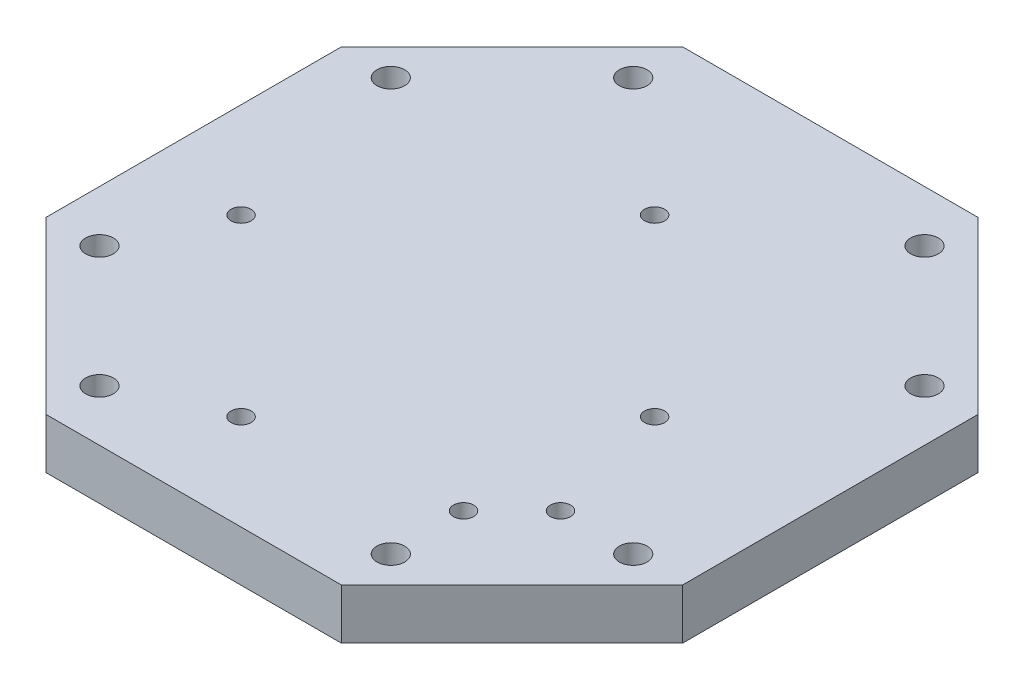
ISO-10303-21;
HEADER;
FILE_DESCRIPTION(('STEP AP214'),'2;1');
FILE_NAME('part.step','',(''),(''),'','','');
FILE_SCHEMA(('AUTOMOTIVE_DESIGN { 1 0 10303 214 1 1 1 1 }'));
ENDSEC;
DATA;
#1=APPLICATION_CONTEXT('core data for automotive mechanical design processes');
#2=APPLICATION_PROTOCOL_DEFINITION('international standard','automotive_design',2000,#1);
#3=PRODUCT_CONTEXT('',#1,'mechanical');
#4=PRODUCT('Part','Part','',(#3));
#5=PRODUCT_RELATED_PRODUCT_CATEGORY('part','',(#4));
#6=PRODUCT_DEFINITION_FORMATION('','',#4);
#7=PRODUCT_DEFINITION_CONTEXT('part definition',#1,'design');
#8=PRODUCT_DEFINITION('design','',#6,#7);
#9=PRODUCT_DEFINITION_SHAPE('','',#8);
#10=(LENGTH_UNIT() NAMED_UNIT(*) SI_UNIT(.MILLI.,.METRE.));
#11=(NAMED_UNIT(*) PLANE_ANGLE_UNIT() SI_UNIT($,.RADIAN.));
#12=(NAMED_UNIT(*) SI_UNIT($,.STERADIAN.) SOLID_ANGLE_UNIT());
#13=UNCERTAINTY_MEASURE_WITH_UNIT(LENGTH_MEASURE(1.E-05),#10,'distance_accuracy_value','');
#14=(GEOMETRIC_REPRESENTATION_CONTEXT(3) GLOBAL_UNCERTAINTY_ASSIGNED_CONTEXT((#13)) GLOBAL_UNIT_ASSIGNED_CONTEXT((#10,
#11,#12)) REPRESENTATION_CONTEXT('',''));
#15=CARTESIAN_POINT('',(0.,0.,0.));
#16=DIRECTION('',(0.,0.,1.));
#17=DIRECTION('',(1.,0.,0.));
#18=AXIS2_PLACEMENT_3D('',#15,#16,#17);
#19=CARTESIAN_POINT('',(29.2914316275719,10.,63.135145942252));
#20=DIRECTION('',(-0.707106781186547,0.,-0.707106781186548));
#21=DIRECTION('',(-0.707106781186548,0.,0.707106781186547));
#22=AXIS2_PLACEMENT_3D('',#19,#20,#21);
#23=PLANE('',#22);
#24=DIRECTION('',(0.707106781186548,0.,-0.707106781186547));
#25=VECTOR('',#24,1.);
#26=CARTESIAN_POINT('',(29.2914316275719,0.,63.135145942252));
#27=LINE('',#26,#25);
#28=CARTESIAN_POINT('',(29.2914316275719,0.,63.135145942252));
#29=VERTEX_POINT('',#28);
#30=CARTESIAN_POINT('',(63.1351459422521,0.,29.2914316275719));
#31=VERTEX_POINT('',#30);
#32=EDGE_CURVE('E141',#29,#31,#27,.T.);
#33=ORIENTED_EDGE('',*,*,#32,.T.);
#34=DIRECTION('',(0.,-1.,0.));
#35=VECTOR('',#34,1.);
#36=CARTESIAN_POINT('',(63.1351459422521,10.,29.2914316275719));
#37=LINE('',#36,#35);
#38=CARTESIAN_POINT('',(63.1351459422521,10.,29.2914316275719));
#39=VERTEX_POINT('',#38);
#40=EDGE_CURVE('E11',#39,#31,#37,.T.);
#41=ORIENTED_EDGE('',*,*,#40,.F.);
#42=DIRECTION('',(0.707106781186548,0.,-0.707106781186547));
#43=VECTOR('',#42,1.);
#44=CARTESIAN_POINT('',(29.2914316275719,10.,63.135145942252));
#45=LINE('',#44,#43);
#46=CARTESIAN_POINT('',(29.2914316275719,10.,63.135145942252));
#47=VERTEX_POINT('',#46);
#48=EDGE_CURVE('E156',#47,#39,#45,.T.);
#49=ORIENTED_EDGE('',*,*,#48,.F.);
#50=DIRECTION('',(0.,-1.,0.));
#51=VECTOR('',#50,1.);
#52=CARTESIAN_POINT('',(29.2914316275719,10.,63.135145942252));
#53=LINE('',#52,#51);
#54=EDGE_CURVE('E137',#47,#29,#53,.T.);
#55=ORIENTED_EDGE('',*,*,#54,.T.);
#56=EDGE_LOOP('',(#33,#41,#49,#55));
#57=FACE_BOUND('',#56,.T.);
#58=ADVANCED_FACE('F45',(#57),#23,.F.);
#59=CARTESIAN_POINT('',(63.1351459422521,10.,29.2914316275719));
#60=DIRECTION('',(-1.,0.,0.));
#61=DIRECTION('',(0.,0.,1.));
#62=AXIS2_PLACEMENT_3D('',#59,#60,#61);
#63=PLANE('',#62);
#64=DIRECTION('',(0.,0.,-1.));
#65=VECTOR('',#64,1.);
#66=CARTESIAN_POINT('',(63.1351459422521,0.,29.2914316275719));
#67=LINE('',#66,#65);
#68=CARTESIAN_POINT('',(63.1351459422521,0.,-29.2914316275719));
#69=VERTEX_POINT('',#68);
#70=EDGE_CURVE('E144',#31,#69,#67,.T.);
#71=ORIENTED_EDGE('',*,*,#70,.T.);
#72=DIRECTION('',(0.,-1.,0.));
#73=VECTOR('',#72,1.);
#74=CARTESIAN_POINT('',(63.1351459422521,10.,-29.2914316275719));
#75=LINE('',#74,#73);
#76=CARTESIAN_POINT('',(63.1351459422521,10.,-29.2914316275719));
#77=VERTEX_POINT('',#76);
#78=EDGE_CURVE('E53',#77,#69,#75,.T.);
#79=ORIENTED_EDGE('',*,*,#78,.F.);
#80=DIRECTION('',(0.,0.,-1.));
#81=VECTOR('',#80,1.);
#82=CARTESIAN_POINT('',(63.1351459422521,10.,29.2914316275719));
#83=LINE('',#82,#81);
#84=EDGE_CURVE('E104',#39,#77,#83,.T.);
#85=ORIENTED_EDGE('',*,*,#84,.F.);
#86=ORIENTED_EDGE('',*,*,#40,.T.);
#87=EDGE_LOOP('',(#71,#79,#85,#86));
#88=FACE_BOUND('',#87,.T.);
#89=ADVANCED_FACE('F387',(#88),#63,.F.);
#90=CARTESIAN_POINT('',(63.1351459422521,10.,-29.2914316275719));
#91=DIRECTION('',(-0.707106781186547,0.,0.707106781186548));
#92=DIRECTION('',(0.707106781186548,0.,0.707106781186547));
#93=AXIS2_PLACEMENT_3D('',#90,#91,#92);
#94=PLANE('',#93);
#95=DIRECTION('',(-0.707106781186548,0.,-0.707106781186547));
#96=VECTOR('',#95,1.);
#97=CARTESIAN_POINT('',(63.1351459422521,0.,-29.2914316275719));
#98=LINE('',#97,#96);
#99=CARTESIAN_POINT('',(29.2914316275719,0.,-63.135145942252));
#100=VERTEX_POINT('',#99);
#101=EDGE_CURVE('E147',#69,#100,#98,.T.);
#102=ORIENTED_EDGE('',*,*,#101,.T.);
#103=DIRECTION('',(0.,-1.,0.));
#104=VECTOR('',#103,1.);
#105=CARTESIAN_POINT('',(29.2914316275719,10.,-63.135145942252));
#106=LINE('',#105,#104);
#107=CARTESIAN_POINT('',(29.2914316275719,10.,-63.135145942252));
#108=VERTEX_POINT('',#107);
#109=EDGE_CURVE('E163',#108,#100,#106,.T.);
#110=ORIENTED_EDGE('',*,*,#109,.F.);
#111=DIRECTION('',(-0.707106781186548,0.,-0.707106781186547));
#112=VECTOR('',#111,1.);
#113=CARTESIAN_POINT('',(63.1351459422521,10.,-29.2914316275719));
#114=LINE('',#113,#112);
#115=EDGE_CURVE('E171',#77,#108,#114,.T.);
#116=ORIENTED_EDGE('',*,*,#115,.F.);
#117=ORIENTED_EDGE('',*,*,#78,.T.);
#118=EDGE_LOOP('',(#102,#110,#116,#117));
#119=FACE_BOUND('',#118,.T.);
#120=ADVANCED_FACE('F169',(#119),#94,.F.);
#121=CARTESIAN_POINT('',(29.2914316275719,10.,-63.135145942252));
#122=DIRECTION('',(0.,0.,1.));
#123=DIRECTION('',(1.,0.,0.));
#124=AXIS2_PLACEMENT_3D('',#121,#122,#123);
#125=PLANE('',#124);
#126=DIRECTION('',(-1.,0.,0.));
#127=VECTOR('',#126,1.);
#128=CARTESIAN_POINT('',(29.2914316275719,0.,-63.135145942252));
#129=LINE('',#128,#127);
#130=CARTESIAN_POINT('',(-29.2914316275719,0.,-63.135145942252));
#131=VERTEX_POINT('',#130);
#132=EDGE_CURVE('E149',#100,#131,#129,.T.);
#133=ORIENTED_EDGE('',*,*,#132,.T.);
#134=DIRECTION('',(0.,-1.,0.));
#135=VECTOR('',#134,1.);
#136=CARTESIAN_POINT('',(-29.2914316275719,10.,-63.135145942252));
#137=LINE('',#136,#135);
#138=CARTESIAN_POINT('',(-29.2914316275719,10.,-63.135145942252));
#139=VERTEX_POINT('',#138);
#140=EDGE_CURVE('E160',#139,#131,#137,.T.);
#141=ORIENTED_EDGE('',*,*,#140,.F.);
#142=DIRECTION('',(-1.,0.,0.));
#143=VECTOR('',#142,1.);
#144=CARTESIAN_POINT('',(29.2914316275719,10.,-63.135145942252));
#145=LINE('',#144,#143);
#146=EDGE_CURVE('E183',#108,#139,#145,.T.);
#147=ORIENTED_EDGE('',*,*,#146,.F.);
#148=ORIENTED_EDGE('',*,*,#109,.T.);
#149=EDGE_LOOP('',(#133,#141,#147,#148));
#150=FACE_BOUND('',#149,.T.);
#151=ADVANCED_FACE('F179',(#150),#125,.F.);
#152=CARTESIAN_POINT('',(-29.2914316275719,10.,-63.135145942252));
#153=DIRECTION('',(0.707106781186548,0.,0.707106781186548));
#154=DIRECTION('',(0.707106781186548,0.,-0.707106781186548));
#155=AXIS2_PLACEMENT_3D('',#152,#153,#154);
#156=PLANE('',#155);
#157=DIRECTION('',(-0.707106781186548,0.,0.707106781186548));
#158=VECTOR('',#157,1.);
#159=CARTESIAN_POINT('',(-29.2914316275719,0.,-63.135145942252));
#160=LINE('',#159,#158);
#161=CARTESIAN_POINT('',(-63.135145942252,0.,-29.2914316275719));
#162=VERTEX_POINT('',#161);
#163=EDGE_CURVE('E151',#131,#162,#160,.T.);
#164=ORIENTED_EDGE('',*,*,#163,.T.);
#165=DIRECTION('',(0.,-1.,0.));
#166=VECTOR('',#165,1.);
#167=CARTESIAN_POINT('',(-63.135145942252,10.,-29.2914316275719));
#168=LINE('',#167,#166);
#169=CARTESIAN_POINT('',(-63.135145942252,10.,-29.2914316275719));
#170=VERTEX_POINT('',#169);
#171=EDGE_CURVE('E132',#170,#162,#168,.T.);
#172=ORIENTED_EDGE('',*,*,#171,.F.);
#173=DIRECTION('',(-0.707106781186548,0.,0.707106781186548));
#174=VECTOR('',#173,1.);
#175=CARTESIAN_POINT('',(-29.2914316275719,10.,-63.135145942252));
#176=LINE('',#175,#174);
#177=EDGE_CURVE('E123',#139,#170,#176,.T.);
#178=ORIENTED_EDGE('',*,*,#177,.F.);
#179=ORIENTED_EDGE('',*,*,#140,.T.);
#180=EDGE_LOOP('',(#164,#172,#178,#179));
#181=FACE_BOUND('',#180,.T.);
#182=ADVANCED_FACE('F182',(#181),#156,.F.);
#183=CARTESIAN_POINT('',(-63.135145942252,10.,-29.2914316275719));
#184=DIRECTION('',(1.,0.,0.));
#185=DIRECTION('',(0.,0.,-1.));
#186=AXIS2_PLACEMENT_3D('',#183,#184,#185);
#187=PLANE('',#186);
#188=DIRECTION('',(0.,0.,1.));
#189=VECTOR('',#188,1.);
#190=CARTESIAN_POINT('',(-63.135145942252,0.,-29.2914316275719));
#191=LINE('',#190,#189);
#192=CARTESIAN_POINT('',(-63.135145942252,0.,29.2914316275719));
#193=VERTEX_POINT('',#192);
#194=EDGE_CURVE('E131',#162,#193,#191,.T.);
#195=ORIENTED_EDGE('',*,*,#194,.T.);
#196=DIRECTION('',(0.,-1.,0.));
#197=VECTOR('',#196,1.);
#198=CARTESIAN_POINT('',(-63.135145942252,10.,29.2914316275719));
#199=LINE('',#198,#197);
#200=CARTESIAN_POINT('',(-63.135145942252,10.,29.2914316275719));
#201=VERTEX_POINT('',#200);
#202=EDGE_CURVE('E128',#201,#193,#199,.T.);
#203=ORIENTED_EDGE('',*,*,#202,.F.);
#204=DIRECTION('',(0.,0.,1.));
#205=VECTOR('',#204,1.);
#206=CARTESIAN_POINT('',(-63.135145942252,10.,-29.2914316275719));
#207=LINE('',#206,#205);
#208=EDGE_CURVE('E117',#170,#201,#207,.T.);
#209=ORIENTED_EDGE('',*,*,#208,.F.);
#210=ORIENTED_EDGE('',*,*,#171,.T.);
#211=EDGE_LOOP('',(#195,#203,#209,#210));
#212=FACE_BOUND('',#211,.T.);
#213=ADVANCED_FACE('F129',(#212),#187,.F.);
#214=CARTESIAN_POINT('',(-63.135145942252,10.,29.2914316275719));
#215=DIRECTION('',(0.707106781186548,0.,-0.707106781186548));
#216=DIRECTION('',(-0.707106781186548,0.,-0.707106781186548));
#217=AXIS2_PLACEMENT_3D('',#214,#215,#216);
#218=PLANE('',#217);
#219=DIRECTION('',(0.707106781186548,0.,0.707106781186548));
#220=VECTOR('',#219,1.);
#221=CARTESIAN_POINT('',(-63.135145942252,0.,29.2914316275719));
#222=LINE('',#221,#220);
#223=CARTESIAN_POINT('',(-29.2914316275719,0.,63.135145942252));
#224=VERTEX_POINT('',#223);
#225=EDGE_CURVE('E90',#193,#224,#222,.T.);
#226=ORIENTED_EDGE('',*,*,#225,.T.);
#227=DIRECTION('',(0.,-1.,0.));
#228=VECTOR('',#227,1.);
#229=CARTESIAN_POINT('',(-29.2914316275719,10.,63.135145942252));
#230=LINE('',#229,#228);
#231=CARTESIAN_POINT('',(-29.2914316275719,10.,63.135145942252));
#232=VERTEX_POINT('',#231);
#233=EDGE_CURVE('E133',#232,#224,#230,.T.);
#234=ORIENTED_EDGE('',*,*,#233,.F.);
#235=DIRECTION('',(0.707106781186548,0.,0.707106781186548));
#236=VECTOR('',#235,1.);
#237=CARTESIAN_POINT('',(-63.135145942252,10.,29.2914316275719));
#238=LINE('',#237,#236);
#239=EDGE_CURVE('E121',#201,#232,#238,.T.);
#240=ORIENTED_EDGE('',*,*,#239,.F.);
#241=ORIENTED_EDGE('',*,*,#202,.T.);
#242=EDGE_LOOP('',(#226,#234,#240,#241));
#243=FACE_BOUND('',#242,.T.);
#244=ADVANCED_FACE('F135',(#243),#218,.F.);
#245=CARTESIAN_POINT('',(-29.2914316275719,10.,63.135145942252));
#246=DIRECTION('',(0.,0.,-1.));
#247=DIRECTION('',(-1.,0.,0.));
#248=AXIS2_PLACEMENT_3D('',#245,#246,#247);
#249=PLANE('',#248);
#250=DIRECTION('',(1.,0.,0.));
#251=VECTOR('',#250,1.);
#252=CARTESIAN_POINT('',(-29.2914316275719,0.,63.135145942252));
#253=LINE('',#252,#251);
#254=EDGE_CURVE('E96',#224,#29,#253,.T.);
#255=ORIENTED_EDGE('',*,*,#254,.T.);
#256=ORIENTED_EDGE('',*,*,#54,.F.);
#257=DIRECTION('',(1.,0.,0.));
#258=VECTOR('',#257,1.);
#259=CARTESIAN_POINT('',(-29.2914316275719,10.,63.135145942252));
#260=LINE('',#259,#258);
#261=EDGE_CURVE('E61',#232,#47,#260,.T.);
#262=ORIENTED_EDGE('',*,*,#261,.F.);
#263=ORIENTED_EDGE('',*,*,#233,.T.);
#264=EDGE_LOOP('',(#255,#256,#262,#263));
#265=FACE_BOUND('',#264,.T.);
#266=ADVANCED_FACE('F379',(#265),#249,.F.);
#267=CARTESIAN_POINT('',(0.,10.,0.));
#268=DIRECTION('',(0.,1.,0.));
#269=DIRECTION('',(0.,0.,1.));
#270=AXIS2_PLACEMENT_3D('',#267,#268,#269);
#271=PLANE('',#270);
#272=CARTESIAN_POINT('',(-44.1941738241592,10.,9.5459415460184));
#273=DIRECTION('',(0.,-1.,0.));
#274=DIRECTION('',(0.,0.,-1.));
#275=AXIS2_PLACEMENT_3D('',#272,#273,#274);
#276=CIRCLE('',#275,2.);
#277=CARTESIAN_POINT('',(-44.1941738241592,10.,7.5459415460184));
#278=VERTEX_POINT('',#277);
#279=EDGE_CURVE('E284',#278,#278,#276,.T.);
#280=ORIENTED_EDGE('',*,*,#279,.T.);
#281=EDGE_LOOP('',(#280));
#282=FACE_BOUND('',#281,.T.);
#283=CARTESIAN_POINT('',(-9.54594154601836,10.,44.1941738241592));
#284=DIRECTION('',(0.,-1.,0.));
#285=DIRECTION('',(0.,0.,-1.));
#286=AXIS2_PLACEMENT_3D('',#283,#284,#285);
#287=CIRCLE('',#286,2.);
#288=CARTESIAN_POINT('',(-9.54594154601836,10.,42.1941738241592));
#289=VERTEX_POINT('',#288);
#290=EDGE_CURVE('E309',#289,#289,#287,.T.);
#291=ORIENTED_EDGE('',*,*,#290,.T.);
#292=EDGE_LOOP('',(#291));
#293=FACE_BOUND('',#292,.T.);
#294=CARTESIAN_POINT('',(-3.18198051533946,10.,-31.4662517628014));
#295=DIRECTION('',(0.,-1.,0.));
#296=DIRECTION('',(0.,0.,-1.));
#297=AXIS2_PLACEMENT_3D('',#294,#295,#296);
#298=CIRCLE('',#297,2.);
#299=CARTESIAN_POINT('',(-3.18198051533946,10.,-33.4662517628014));
#300=VERTEX_POINT('',#299);
#301=EDGE_CURVE('E303',#300,#300,#298,.T.);
#302=ORIENTED_EDGE('',*,*,#301,.T.);
#303=EDGE_LOOP('',(#302));
#304=FACE_BOUND('',#303,.T.);
#305=CARTESIAN_POINT('',(31.4662517628014,10.,3.18198051533945));
#306=DIRECTION('',(0.,-1.,0.));
#307=DIRECTION('',(0.,0.,-1.));
#308=AXIS2_PLACEMENT_3D('',#305,#306,#307);
#309=CIRCLE('',#308,2.);
#310=CARTESIAN_POINT('',(31.4662517628014,10.,1.18198051533945));
#311=VERTEX_POINT('',#310);
#312=EDGE_CURVE('E297',#311,#311,#309,.T.);
#313=ORIENTED_EDGE('',*,*,#312,.T.);
#314=EDGE_LOOP('',(#313));
#315=FACE_BOUND('',#314,.T.);
#316=CARTESIAN_POINT('',(28.6770406114856,10.,38.2936928356227));
#317=DIRECTION('',(0.,-1.,0.));
#318=DIRECTION('',(0.,0.,-1.));
#319=AXIS2_PLACEMENT_3D('',#316,#317,#318);
#320=CIRCLE('',#319,2.00000000000001);
#321=CARTESIAN_POINT('',(28.6770406114856,10.,36.2936928356226));
#322=VERTEX_POINT('',#321);
#323=EDGE_CURVE('E291',#322,#322,#320,.T.);
#324=ORIENTED_EDGE('',*,*,#323,.T.);
#325=EDGE_LOOP('',(#324));
#326=FACE_BOUND('',#325,.T.);
#327=CARTESIAN_POINT('',(38.2936928356227,10.,28.6770406114856));
#328=DIRECTION('',(0.,-1.,0.));
#329=DIRECTION('',(0.,0.,-1.));
#330=AXIS2_PLACEMENT_3D('',#327,#328,#329);
#331=CIRCLE('',#330,2.);
#332=CARTESIAN_POINT('',(38.2936928356227,10.,26.6770406114856));
#333=VERTEX_POINT('',#332);
#334=EDGE_CURVE('E285',#333,#333,#331,.T.);
#335=ORIENTED_EDGE('',*,*,#334,.T.);
#336=EDGE_LOOP('',(#335));
#337=FACE_BOUND('',#336,.T.);
#338=CARTESIAN_POINT('',(-28.8891726458416,10.,-52.9308032061842));
#339=DIRECTION('',(0.,1.,0.));
#340=DIRECTION('',(0.,0.,1.));
#341=AXIS2_PLACEMENT_3D('',#338,#339,#340);
#342=CIRCLE('',#341,2.75);
#343=CARTESIAN_POINT('',(-28.8891726458416,10.,-50.1808032061842));
#344=VERTEX_POINT('',#343);
#345=EDGE_CURVE('E281',#344,#344,#342,.T.);
#346=ORIENTED_EDGE('',*,*,#345,.F.);
#347=EDGE_LOOP('',(#346));
#348=FACE_BOUND('',#347,.T.);
#349=CARTESIAN_POINT('',(-52.9308032061842,10.,-28.8891726458416));
#350=DIRECTION('',(0.,1.,0.));
#351=DIRECTION('',(0.,0.,1.));
#352=AXIS2_PLACEMENT_3D('',#349,#350,#351);
#353=CIRCLE('',#352,2.75);
#354=CARTESIAN_POINT('',(-52.9308032061842,10.,-26.1391726458416));
#355=VERTEX_POINT('',#354);
#356=EDGE_CURVE('E269',#355,#355,#353,.T.);
#357=ORIENTED_EDGE('',*,*,#356,.F.);
#358=EDGE_LOOP('',(#357));
#359=FACE_BOUND('',#358,.T.);
#360=CARTESIAN_POINT('',(-52.9308032061842,10.,28.8891726458416));
#361=DIRECTION('',(0.,1.,0.));
#362=DIRECTION('',(0.,0.,1.));
#363=AXIS2_PLACEMENT_3D('',#360,#361,#362);
#364=CIRCLE('',#363,2.75);
#365=CARTESIAN_POINT('',(-52.9308032061842,10.,31.6391726458416));
#366=VERTEX_POINT('',#365);
#367=EDGE_CURVE('E257',#366,#366,#364,.T.);
#368=ORIENTED_EDGE('',*,*,#367,.F.);
#369=EDGE_LOOP('',(#368));
#370=FACE_BOUND('',#369,.T.);
#371=CARTESIAN_POINT('',(-28.8891726458416,10.,52.9308032061842));
#372=DIRECTION('',(0.,1.,0.));
#373=DIRECTION('',(0.,0.,1.));
#374=AXIS2_PLACEMENT_3D('',#371,#372,#373);
#375=CIRCLE('',#374,2.75);
#376=CARTESIAN_POINT('',(-28.8891726458416,10.,55.6808032061842));
#377=VERTEX_POINT('',#376);
#378=EDGE_CURVE('E245',#377,#377,#375,.T.);
#379=ORIENTED_EDGE('',*,*,#378,.F.);
#380=EDGE_LOOP('',(#379));
#381=FACE_BOUND('',#380,.T.);
#382=CARTESIAN_POINT('',(28.8891726458416,10.,52.9308032061842));
#383=DIRECTION('',(0.,1.,0.));
#384=DIRECTION('',(0.,0.,1.));
#385=AXIS2_PLACEMENT_3D('',#382,#383,#384);
#386=CIRCLE('',#385,2.75);
#387=CARTESIAN_POINT('',(28.8891726458416,10.,55.6808032061842));
#388=VERTEX_POINT('',#387);
#389=EDGE_CURVE('E233',#388,#388,#386,.T.);
#390=ORIENTED_EDGE('',*,*,#389,.F.);
#391=EDGE_LOOP('',(#390));
#392=FACE_BOUND('',#391,.T.);
#393=CARTESIAN_POINT('',(52.9308032061842,10.,28.8891726458416));
#394=DIRECTION('',(0.,1.,0.));
#395=DIRECTION('',(0.,0.,1.));
#396=AXIS2_PLACEMENT_3D('',#393,#394,#395);
#397=CIRCLE('',#396,2.75);
#398=CARTESIAN_POINT('',(52.9308032061842,10.,31.6391726458416));
#399=VERTEX_POINT('',#398);
#400=EDGE_CURVE('E221',#399,#399,#397,.T.);
#401=ORIENTED_EDGE('',*,*,#400,.F.);
#402=EDGE_LOOP('',(#401));
#403=FACE_BOUND('',#402,.T.);
#404=CARTESIAN_POINT('',(52.9308032061842,10.,-28.8891726458416));
#405=DIRECTION('',(0.,1.,0.));
#406=DIRECTION('',(0.,0.,1.));
#407=AXIS2_PLACEMENT_3D('',#404,#405,#406);
#408=CIRCLE('',#407,2.75);
#409=CARTESIAN_POINT('',(52.9308032061842,10.,-26.1391726458416));
#410=VERTEX_POINT('',#409);
#411=EDGE_CURVE('E209',#410,#410,#408,.T.);
#412=ORIENTED_EDGE('',*,*,#411,.F.);
#413=EDGE_LOOP('',(#412));
#414=FACE_BOUND('',#413,.T.);
#415=CARTESIAN_POINT('',(28.8891726458416,10.,-52.9308032061842));
#416=DIRECTION('',(0.,1.,0.));
#417=DIRECTION('',(0.,0.,1.));
#418=AXIS2_PLACEMENT_3D('',#415,#416,#417);
#419=CIRCLE('',#418,2.75);
#420=CARTESIAN_POINT('',(28.8891726458416,10.,-50.1808032061842));
#421=VERTEX_POINT('',#420);
#422=EDGE_CURVE('E197',#421,#421,#419,.T.);
#423=ORIENTED_EDGE('',*,*,#422,.F.);
#424=EDGE_LOOP('',(#423));
#425=FACE_BOUND('',#424,.T.);
#426=ORIENTED_EDGE('',*,*,#48,.T.);
#427=ORIENTED_EDGE('',*,*,#84,.T.);
#428=ORIENTED_EDGE('',*,*,#115,.T.);
#429=ORIENTED_EDGE('',*,*,#146,.T.);
#430=ORIENTED_EDGE('',*,*,#177,.T.);
#431=ORIENTED_EDGE('',*,*,#208,.T.);
#432=ORIENTED_EDGE('',*,*,#239,.T.);
#433=ORIENTED_EDGE('',*,*,#261,.T.);
#434=EDGE_LOOP('',(#426,#427,#428,#429,#430,#431,#432,#433));
#435=FACE_BOUND('',#434,.T.);
#436=ADVANCED_FACE('F119',(#282,#293,#304,#315,#326,#337,#348,#359,#370,#381,#392,#403,#414,
#425,#435),#271,.T.);
#437=CARTESIAN_POINT('',(0.,0.,0.));
#438=DIRECTION('',(0.,1.,0.));
#439=DIRECTION('',(0.,0.,1.));
#440=AXIS2_PLACEMENT_3D('',#437,#438,#439);
#441=PLANE('',#440);
#442=CARTESIAN_POINT('',(-44.1941738241592,0.,9.5459415460184));
#443=DIRECTION('',(0.,-1.,0.));
#444=DIRECTION('',(0.,0.,-1.));
#445=AXIS2_PLACEMENT_3D('',#442,#443,#444);
#446=CIRCLE('',#445,2.);
#447=CARTESIAN_POINT('',(-44.1941738241592,0.,7.5459415460184));
#448=VERTEX_POINT('',#447);
#449=EDGE_CURVE('E315',#448,#448,#446,.T.);
#450=ORIENTED_EDGE('',*,*,#449,.F.);
#451=EDGE_LOOP('',(#450));
#452=FACE_BOUND('',#451,.T.);
#453=CARTESIAN_POINT('',(-9.54594154601836,0.,44.1941738241592));
#454=DIRECTION('',(0.,-1.,0.));
#455=DIRECTION('',(0.,0.,-1.));
#456=AXIS2_PLACEMENT_3D('',#453,#454,#455);
#457=CIRCLE('',#456,2.);
#458=CARTESIAN_POINT('',(-9.54594154601836,0.,42.1941738241592));
#459=VERTEX_POINT('',#458);
#460=EDGE_CURVE('E312',#459,#459,#457,.T.);
#461=ORIENTED_EDGE('',*,*,#460,.F.);
#462=EDGE_LOOP('',(#461));
#463=FACE_BOUND('',#462,.T.);
#464=CARTESIAN_POINT('',(-3.18198051533946,0.,-31.4662517628014));
#465=DIRECTION('',(0.,-1.,0.));
#466=DIRECTION('',(0.,0.,-1.));
#467=AXIS2_PLACEMENT_3D('',#464,#465,#466);
#468=CIRCLE('',#467,2.);
#469=CARTESIAN_POINT('',(-3.18198051533946,0.,-33.4662517628014));
#470=VERTEX_POINT('',#469);
#471=EDGE_CURVE('E306',#470,#470,#468,.T.);
#472=ORIENTED_EDGE('',*,*,#471,.F.);
#473=EDGE_LOOP('',(#472));
#474=FACE_BOUND('',#473,.T.);
#475=CARTESIAN_POINT('',(31.4662517628014,0.,3.18198051533945));
#476=DIRECTION('',(0.,-1.,0.));
#477=DIRECTION('',(0.,0.,-1.));
#478=AXIS2_PLACEMENT_3D('',#475,#476,#477);
#479=CIRCLE('',#478,2.);
#480=CARTESIAN_POINT('',(31.4662517628014,0.,1.18198051533945));
#481=VERTEX_POINT('',#480);
#482=EDGE_CURVE('E300',#481,#481,#479,.T.);
#483=ORIENTED_EDGE('',*,*,#482,.F.);
#484=EDGE_LOOP('',(#483));
#485=FACE_BOUND('',#484,.T.);
#486=CARTESIAN_POINT('',(28.6770406114856,0.,38.2936928356227));
#487=DIRECTION('',(0.,-1.,0.));
#488=DIRECTION('',(0.,0.,-1.));
#489=AXIS2_PLACEMENT_3D('',#486,#487,#488);
#490=CIRCLE('',#489,2.00000000000001);
#491=CARTESIAN_POINT('',(28.6770406114856,0.,36.2936928356226));
#492=VERTEX_POINT('',#491);
#493=EDGE_CURVE('E294',#492,#492,#490,.T.);
#494=ORIENTED_EDGE('',*,*,#493,.F.);
#495=EDGE_LOOP('',(#494));
#496=FACE_BOUND('',#495,.T.);
#497=CARTESIAN_POINT('',(38.2936928356227,0.,28.6770406114856));
#498=DIRECTION('',(0.,-1.,0.));
#499=DIRECTION('',(0.,0.,-1.));
#500=AXIS2_PLACEMENT_3D('',#497,#498,#499);
#501=CIRCLE('',#500,2.);
#502=CARTESIAN_POINT('',(38.2936928356227,0.,26.6770406114856));
#503=VERTEX_POINT('',#502);
#504=EDGE_CURVE('E288',#503,#503,#501,.T.);
#505=ORIENTED_EDGE('',*,*,#504,.F.);
#506=EDGE_LOOP('',(#505));
#507=FACE_BOUND('',#506,.T.);
#508=CARTESIAN_POINT('',(-28.8891726458416,0.,-52.9308032061842));
#509=DIRECTION('',(0.,1.,0.));
#510=DIRECTION('',(0.,0.,1.));
#511=AXIS2_PLACEMENT_3D('',#508,#509,#510);
#512=CIRCLE('',#511,2.);
#513=CARTESIAN_POINT('',(-28.8891726458416,0.,-50.9308032061842));
#514=VERTEX_POINT('',#513);
#515=EDGE_CURVE('E272',#514,#514,#512,.T.);
#516=ORIENTED_EDGE('',*,*,#515,.T.);
#517=EDGE_LOOP('',(#516));
#518=FACE_BOUND('',#517,.T.);
#519=CARTESIAN_POINT('',(-52.9308032061842,0.,-28.8891726458416));
#520=DIRECTION('',(0.,1.,0.));
#521=DIRECTION('',(0.,0.,1.));
#522=AXIS2_PLACEMENT_3D('',#519,#520,#521);
#523=CIRCLE('',#522,1.99999999999999);
#524=CARTESIAN_POINT('',(-52.9308032061842,0.,-26.8891726458416));
#525=VERTEX_POINT('',#524);
#526=EDGE_CURVE('E260',#525,#525,#523,.T.);
#527=ORIENTED_EDGE('',*,*,#526,.T.);
#528=EDGE_LOOP('',(#527));
#529=FACE_BOUND('',#528,.T.);
#530=CARTESIAN_POINT('',(-52.9308032061842,0.,28.8891726458416));
#531=DIRECTION('',(0.,1.,0.));
#532=DIRECTION('',(0.,0.,1.));
#533=AXIS2_PLACEMENT_3D('',#530,#531,#532);
#534=CIRCLE('',#533,1.99999999999999);
#535=CARTESIAN_POINT('',(-52.9308032061842,0.,30.8891726458416));
#536=VERTEX_POINT('',#535);
#537=EDGE_CURVE('E248',#536,#536,#534,.T.);
#538=ORIENTED_EDGE('',*,*,#537,.T.);
#539=EDGE_LOOP('',(#538));
#540=FACE_BOUND('',#539,.T.);
#541=CARTESIAN_POINT('',(-28.8891726458416,0.,52.9308032061842));
#542=DIRECTION('',(0.,1.,0.));
#543=DIRECTION('',(0.,0.,1.));
#544=AXIS2_PLACEMENT_3D('',#541,#542,#543);
#545=CIRCLE('',#544,2.);
#546=CARTESIAN_POINT('',(-28.8891726458416,0.,54.9308032061842));
#547=VERTEX_POINT('',#546);
#548=EDGE_CURVE('E236',#547,#547,#545,.T.);
#549=ORIENTED_EDGE('',*,*,#548,.T.);
#550=EDGE_LOOP('',(#549));
#551=FACE_BOUND('',#550,.T.);
#552=CARTESIAN_POINT('',(28.8891726458416,0.,52.9308032061842));
#553=DIRECTION('',(0.,1.,0.));
#554=DIRECTION('',(0.,0.,1.));
#555=AXIS2_PLACEMENT_3D('',#552,#553,#554);
#556=CIRCLE('',#555,2.);
#557=CARTESIAN_POINT('',(28.8891726458416,0.,54.9308032061842));
#558=VERTEX_POINT('',#557);
#559=EDGE_CURVE('E224',#558,#558,#556,.T.);
#560=ORIENTED_EDGE('',*,*,#559,.T.);
#561=EDGE_LOOP('',(#560));
#562=FACE_BOUND('',#561,.T.);
#563=CARTESIAN_POINT('',(52.9308032061842,0.,28.8891726458416));
#564=DIRECTION('',(0.,1.,0.));
#565=DIRECTION('',(0.,0.,1.));
#566=AXIS2_PLACEMENT_3D('',#563,#564,#565);
#567=CIRCLE('',#566,1.99999999999999);
#568=CARTESIAN_POINT('',(52.9308032061842,0.,30.8891726458416));
#569=VERTEX_POINT('',#568);
#570=EDGE_CURVE('E212',#569,#569,#567,.T.);
#571=ORIENTED_EDGE('',*,*,#570,.T.);
#572=EDGE_LOOP('',(#571));
#573=FACE_BOUND('',#572,.T.);
#574=CARTESIAN_POINT('',(52.9308032061842,0.,-28.8891726458416));
#575=DIRECTION('',(0.,1.,0.));
#576=DIRECTION('',(0.,0.,1.));
#577=AXIS2_PLACEMENT_3D('',#574,#575,#576);
#578=CIRCLE('',#577,1.99999999999999);
#579=CARTESIAN_POINT('',(52.9308032061842,0.,-26.8891726458416));
#580=VERTEX_POINT('',#579);
#581=EDGE_CURVE('E200',#580,#580,#578,.T.);
#582=ORIENTED_EDGE('',*,*,#581,.T.);
#583=EDGE_LOOP('',(#582));
#584=FACE_BOUND('',#583,.T.);
#585=CARTESIAN_POINT('',(28.8891726458416,0.,-52.9308032061842));
#586=DIRECTION('',(0.,1.,0.));
#587=DIRECTION('',(0.,0.,1.));
#588=AXIS2_PLACEMENT_3D('',#585,#586,#587);
#589=CIRCLE('',#588,2.);
#590=CARTESIAN_POINT('',(28.8891726458416,0.,-50.9308032061842));
#591=VERTEX_POINT('',#590);
#592=EDGE_CURVE('E145',#591,#591,#589,.T.);
#593=ORIENTED_EDGE('',*,*,#592,.T.);
#594=EDGE_LOOP('',(#593));
#595=FACE_BOUND('',#594,.T.);
#596=ORIENTED_EDGE('',*,*,#32,.F.);
#597=ORIENTED_EDGE('',*,*,#254,.F.);
#598=ORIENTED_EDGE('',*,*,#225,.F.);
#599=ORIENTED_EDGE('',*,*,#194,.F.);
#600=ORIENTED_EDGE('',*,*,#163,.F.);
#601=ORIENTED_EDGE('',*,*,#132,.F.);
#602=ORIENTED_EDGE('',*,*,#101,.F.);
#603=ORIENTED_EDGE('',*,*,#70,.F.);
#604=EDGE_LOOP('',(#596,#597,#598,#599,#600,#601,#602,#603));
#605=FACE_BOUND('',#604,.T.);
#606=ADVANCED_FACE('F175',(#452,#463,#474,#485,#496,#507,#518,#529,#540,#551,#562,#573,#584,
#595,#605),#441,.F.);
#607=CARTESIAN_POINT('',(28.8891726458416,10.,-52.9308032061842));
#608=DIRECTION('',(0.,1.,0.));
#609=DIRECTION('',(0.,0.,1.));
#610=AXIS2_PLACEMENT_3D('',#607,#608,#609);
#611=CYLINDRICAL_SURFACE('',#610,2.00000000000001);
#612=ORIENTED_EDGE('',*,*,#592,.F.);
#613=EDGE_LOOP('',(#612));
#614=FACE_BOUND('',#613,.T.);
#615=CARTESIAN_POINT('',(28.8891726458416,6.,-52.9308032061842));
#616=DIRECTION('',(0.,1.,0.));
#617=DIRECTION('',(0.,0.,1.));
#618=AXIS2_PLACEMENT_3D('',#615,#616,#617);
#619=CIRCLE('',#618,2.00000000000001);
#620=CARTESIAN_POINT('',(28.8891726458416,6.,-50.9308032061842));
#621=VERTEX_POINT('',#620);
#622=EDGE_CURVE('E191',#621,#621,#619,.T.);
#623=ORIENTED_EDGE('',*,*,#622,.T.);
#624=EDGE_LOOP('',(#623));
#625=FACE_BOUND('',#624,.T.);
#626=ADVANCED_FACE('F332',(#614,#625),#611,.F.);
#627=CARTESIAN_POINT('',(30.8891726458416,6.,-52.9308032061842));
#628=DIRECTION('',(0.,-1.,0.));
#629=DIRECTION('',(0.,0.,-1.));
#630=AXIS2_PLACEMENT_3D('',#627,#628,#629);
#631=PLANE('',#630);
#632=ORIENTED_EDGE('',*,*,#622,.F.);
#633=EDGE_LOOP('',(#632));
#634=FACE_BOUND('',#633,.T.);
#635=CARTESIAN_POINT('',(28.8891726458416,6.,-52.9308032061842));
#636=DIRECTION('',(0.,1.,0.));
#637=DIRECTION('',(0.,0.,1.));
#638=AXIS2_PLACEMENT_3D('',#635,#636,#637);
#639=CIRCLE('',#638,2.75);
#640=CARTESIAN_POINT('',(28.8891726458416,6.,-50.1808032061842));
#641=VERTEX_POINT('',#640);
#642=EDGE_CURVE('E194',#641,#641,#639,.T.);
#643=ORIENTED_EDGE('',*,*,#642,.T.);
#644=EDGE_LOOP('',(#643));
#645=FACE_BOUND('',#644,.T.);
#646=ADVANCED_FACE('F362',(#634,#645),#631,.F.);
#647=CARTESIAN_POINT('',(28.8891726458416,10.,-52.9308032061842));
#648=DIRECTION('',(0.,1.,0.));
#649=DIRECTION('',(0.,0.,1.));
#650=AXIS2_PLACEMENT_3D('',#647,#648,#649);
#651=CYLINDRICAL_SURFACE('',#650,2.75);
#652=ORIENTED_EDGE('',*,*,#642,.F.);
#653=EDGE_LOOP('',(#652));
#654=FACE_BOUND('',#653,.T.);
#655=ORIENTED_EDGE('',*,*,#422,.T.);
#656=EDGE_LOOP('',(#655));
#657=FACE_BOUND('',#656,.T.);
#658=ADVANCED_FACE('F368',(#654,#657),#651,.F.);
#659=CARTESIAN_POINT('',(52.9308032061842,10.,-28.8891726458416));
#660=DIRECTION('',(0.,1.,0.));
#661=DIRECTION('',(0.,0.,1.));
#662=AXIS2_PLACEMENT_3D('',#659,#660,#661);
#663=CYLINDRICAL_SURFACE('',#662,2.);
#664=ORIENTED_EDGE('',*,*,#581,.F.);
#665=EDGE_LOOP('',(#664));
#666=FACE_BOUND('',#665,.T.);
#667=CARTESIAN_POINT('',(52.9308032061842,6.,-28.8891726458416));
#668=DIRECTION('',(0.,1.,0.));
#669=DIRECTION('',(0.,0.,1.));
#670=AXIS2_PLACEMENT_3D('',#667,#668,#669);
#671=CIRCLE('',#670,2.00000000000001);
#672=CARTESIAN_POINT('',(52.9308032061842,6.,-26.8891726458416));
#673=VERTEX_POINT('',#672);
#674=EDGE_CURVE('E203',#673,#673,#671,.T.);
#675=ORIENTED_EDGE('',*,*,#674,.T.);
#676=EDGE_LOOP('',(#675));
#677=FACE_BOUND('',#676,.T.);
#678=ADVANCED_FACE('F374',(#666,#677),#663,.F.);
#679=CARTESIAN_POINT('',(54.9308032061842,6.,-28.8891726458416));
#680=DIRECTION('',(0.,-1.,0.));
#681=DIRECTION('',(0.,0.,-1.));
#682=AXIS2_PLACEMENT_3D('',#679,#680,#681);
#683=PLANE('',#682);
#684=ORIENTED_EDGE('',*,*,#674,.F.);
#685=EDGE_LOOP('',(#684));
#686=FACE_BOUND('',#685,.T.);
#687=CARTESIAN_POINT('',(52.9308032061842,6.,-28.8891726458416));
#688=DIRECTION('',(0.,1.,0.));
#689=DIRECTION('',(0.,0.,1.));
#690=AXIS2_PLACEMENT_3D('',#687,#688,#689);
#691=CIRCLE('',#690,2.75);
#692=CARTESIAN_POINT('',(52.9308032061842,6.,-26.1391726458416));
#693=VERTEX_POINT('',#692);
#694=EDGE_CURVE('E206',#693,#693,#691,.T.);
#695=ORIENTED_EDGE('',*,*,#694,.T.);
#696=EDGE_LOOP('',(#695));
#697=FACE_BOUND('',#696,.T.);
#698=ADVANCED_FACE('F438',(#686,#697),#683,.F.);
#699=CARTESIAN_POINT('',(52.9308032061842,10.,-28.8891726458416));
#700=DIRECTION('',(0.,1.,0.));
#701=DIRECTION('',(0.,0.,1.));
#702=AXIS2_PLACEMENT_3D('',#699,#700,#701);
#703=CYLINDRICAL_SURFACE('',#702,2.75);
#704=ORIENTED_EDGE('',*,*,#694,.F.);
#705=EDGE_LOOP('',(#704));
#706=FACE_BOUND('',#705,.T.);
#707=ORIENTED_EDGE('',*,*,#411,.T.);
#708=EDGE_LOOP('',(#707));
#709=FACE_BOUND('',#708,.T.);
#710=ADVANCED_FACE('F447',(#706,#709),#703,.F.);
#711=CARTESIAN_POINT('',(52.9308032061842,10.,28.8891726458416));
#712=DIRECTION('',(0.,1.,0.));
#713=DIRECTION('',(0.,0.,1.));
#714=AXIS2_PLACEMENT_3D('',#711,#712,#713);
#715=CYLINDRICAL_SURFACE('',#714,2.);
#716=ORIENTED_EDGE('',*,*,#570,.F.);
#717=EDGE_LOOP('',(#716));
#718=FACE_BOUND('',#717,.T.);
#719=CARTESIAN_POINT('',(52.9308032061842,6.,28.8891726458416));
#720=DIRECTION('',(0.,1.,0.));
#721=DIRECTION('',(0.,0.,1.));
#722=AXIS2_PLACEMENT_3D('',#719,#720,#721);
#723=CIRCLE('',#722,2.00000000000001);
#724=CARTESIAN_POINT('',(52.9308032061842,6.,30.8891726458416));
#725=VERTEX_POINT('',#724);
#726=EDGE_CURVE('E215',#725,#725,#723,.T.);
#727=ORIENTED_EDGE('',*,*,#726,.T.);
#728=EDGE_LOOP('',(#727));
#729=FACE_BOUND('',#728,.T.);
#730=ADVANCED_FACE('F456',(#718,#729),#715,.F.);
#731=CARTESIAN_POINT('',(54.9308032061842,6.,28.8891726458416));
#732=DIRECTION('',(0.,-1.,0.));
#733=DIRECTION('',(0.,0.,-1.));
#734=AXIS2_PLACEMENT_3D('',#731,#732,#733);
#735=PLANE('',#734);
#736=ORIENTED_EDGE('',*,*,#726,.F.);
#737=EDGE_LOOP('',(#736));
#738=FACE_BOUND('',#737,.T.);
#739=CARTESIAN_POINT('',(52.9308032061842,6.,28.8891726458416));
#740=DIRECTION('',(0.,1.,0.));
#741=DIRECTION('',(0.,0.,1.));
#742=AXIS2_PLACEMENT_3D('',#739,#740,#741);
#743=CIRCLE('',#742,2.75);
#744=CARTESIAN_POINT('',(52.9308032061842,6.,31.6391726458416));
#745=VERTEX_POINT('',#744);
#746=EDGE_CURVE('E218',#745,#745,#743,.T.);
#747=ORIENTED_EDGE('',*,*,#746,.T.);
#748=EDGE_LOOP('',(#747));
#749=FACE_BOUND('',#748,.T.);
#750=ADVANCED_FACE('F465',(#738,#749),#735,.F.);
#751=CARTESIAN_POINT('',(52.9308032061842,10.,28.8891726458416));
#752=DIRECTION('',(0.,1.,0.));
#753=DIRECTION('',(0.,0.,1.));
#754=AXIS2_PLACEMENT_3D('',#751,#752,#753);
#755=CYLINDRICAL_SURFACE('',#754,2.75);
#756=ORIENTED_EDGE('',*,*,#746,.F.);
#757=EDGE_LOOP('',(#756));
#758=FACE_BOUND('',#757,.T.);
#759=ORIENTED_EDGE('',*,*,#400,.T.);
#760=EDGE_LOOP('',(#759));
#761=FACE_BOUND('',#760,.T.);
#762=ADVANCED_FACE('F474',(#758,#761),#755,.F.);
#763=CARTESIAN_POINT('',(28.8891726458416,10.,52.9308032061842));
#764=DIRECTION('',(0.,1.,0.));
#765=DIRECTION('',(0.,0.,1.));
#766=AXIS2_PLACEMENT_3D('',#763,#764,#765);
#767=CYLINDRICAL_SURFACE('',#766,2.00000000000001);
#768=ORIENTED_EDGE('',*,*,#559,.F.);
#769=EDGE_LOOP('',(#768));
#770=FACE_BOUND('',#769,.T.);
#771=CARTESIAN_POINT('',(28.8891726458416,6.,52.9308032061842));
#772=DIRECTION('',(0.,1.,0.));
#773=DIRECTION('',(0.,0.,1.));
#774=AXIS2_PLACEMENT_3D('',#771,#772,#773);
#775=CIRCLE('',#774,2.00000000000001);
#776=CARTESIAN_POINT('',(28.8891726458416,6.,54.9308032061842));
#777=VERTEX_POINT('',#776);
#778=EDGE_CURVE('E227',#777,#777,#775,.T.);
#779=ORIENTED_EDGE('',*,*,#778,.T.);
#780=EDGE_LOOP('',(#779));
#781=FACE_BOUND('',#780,.T.);
#782=ADVANCED_FACE('F483',(#770,#781),#767,.F.);
#783=CARTESIAN_POINT('',(30.8891726458416,6.,52.9308032061842));
#784=DIRECTION('',(0.,-1.,0.));
#785=DIRECTION('',(0.,0.,-1.));
#786=AXIS2_PLACEMENT_3D('',#783,#784,#785);
#787=PLANE('',#786);
#788=ORIENTED_EDGE('',*,*,#778,.F.);
#789=EDGE_LOOP('',(#788));
#790=FACE_BOUND('',#789,.T.);
#791=CARTESIAN_POINT('',(28.8891726458416,6.,52.9308032061842));
#792=DIRECTION('',(0.,1.,0.));
#793=DIRECTION('',(0.,0.,1.));
#794=AXIS2_PLACEMENT_3D('',#791,#792,#793);
#795=CIRCLE('',#794,2.75);
#796=CARTESIAN_POINT('',(28.8891726458416,6.,55.6808032061842));
#797=VERTEX_POINT('',#796);
#798=EDGE_CURVE('E230',#797,#797,#795,.T.);
#799=ORIENTED_EDGE('',*,*,#798,.T.);
#800=EDGE_LOOP('',(#799));
#801=FACE_BOUND('',#800,.T.);
#802=ADVANCED_FACE('F492',(#790,#801),#787,.F.);
#803=CARTESIAN_POINT('',(28.8891726458416,10.,52.9308032061842));
#804=DIRECTION('',(0.,1.,0.));
#805=DIRECTION('',(0.,0.,1.));
#806=AXIS2_PLACEMENT_3D('',#803,#804,#805);
#807=CYLINDRICAL_SURFACE('',#806,2.75);
#808=ORIENTED_EDGE('',*,*,#798,.F.);
#809=EDGE_LOOP('',(#808));
#810=FACE_BOUND('',#809,.T.);
#811=ORIENTED_EDGE('',*,*,#389,.T.);
#812=EDGE_LOOP('',(#811));
#813=FACE_BOUND('',#812,.T.);
#814=ADVANCED_FACE('F501',(#810,#813),#807,.F.);
#815=CARTESIAN_POINT('',(-28.8891726458416,10.,52.9308032061842));
#816=DIRECTION('',(0.,1.,0.));
#817=DIRECTION('',(0.,0.,1.));
#818=AXIS2_PLACEMENT_3D('',#815,#816,#817);
#819=CYLINDRICAL_SURFACE('',#818,2.00000000000001);
#820=ORIENTED_EDGE('',*,*,#548,.F.);
#821=EDGE_LOOP('',(#820));
#822=FACE_BOUND('',#821,.T.);
#823=CARTESIAN_POINT('',(-28.8891726458416,6.,52.9308032061842));
#824=DIRECTION('',(0.,1.,0.));
#825=DIRECTION('',(0.,0.,1.));
#826=AXIS2_PLACEMENT_3D('',#823,#824,#825);
#827=CIRCLE('',#826,2.00000000000001);
#828=CARTESIAN_POINT('',(-28.8891726458416,6.,54.9308032061842));
#829=VERTEX_POINT('',#828);
#830=EDGE_CURVE('E239',#829,#829,#827,.T.);
#831=ORIENTED_EDGE('',*,*,#830,.T.);
#832=EDGE_LOOP('',(#831));
#833=FACE_BOUND('',#832,.T.);
#834=ADVANCED_FACE('F510',(#822,#833),#819,.F.);
#835=CARTESIAN_POINT('',(-26.8891726458416,6.,52.9308032061842));
#836=DIRECTION('',(0.,-1.,0.));
#837=DIRECTION('',(0.,0.,-1.));
#838=AXIS2_PLACEMENT_3D('',#835,#836,#837);
#839=PLANE('',#838);
#840=ORIENTED_EDGE('',*,*,#830,.F.);
#841=EDGE_LOOP('',(#840));
#842=FACE_BOUND('',#841,.T.);
#843=CARTESIAN_POINT('',(-28.8891726458416,6.,52.9308032061842));
#844=DIRECTION('',(0.,1.,0.));
#845=DIRECTION('',(0.,0.,1.));
#846=AXIS2_PLACEMENT_3D('',#843,#844,#845);
#847=CIRCLE('',#846,2.75);
#848=CARTESIAN_POINT('',(-28.8891726458416,6.,55.6808032061842));
#849=VERTEX_POINT('',#848);
#850=EDGE_CURVE('E242',#849,#849,#847,.T.);
#851=ORIENTED_EDGE('',*,*,#850,.T.);
#852=EDGE_LOOP('',(#851));
#853=FACE_BOUND('',#852,.T.);
#854=ADVANCED_FACE('F519',(#842,#853),#839,.F.);
#855=CARTESIAN_POINT('',(-28.8891726458416,10.,52.9308032061842));
#856=DIRECTION('',(0.,1.,0.));
#857=DIRECTION('',(0.,0.,1.));
#858=AXIS2_PLACEMENT_3D('',#855,#856,#857);
#859=CYLINDRICAL_SURFACE('',#858,2.75);
#860=ORIENTED_EDGE('',*,*,#850,.F.);
#861=EDGE_LOOP('',(#860));
#862=FACE_BOUND('',#861,.T.);
#863=ORIENTED_EDGE('',*,*,#378,.T.);
#864=EDGE_LOOP('',(#863));
#865=FACE_BOUND('',#864,.T.);
#866=ADVANCED_FACE('F528',(#862,#865),#859,.F.);
#867=CARTESIAN_POINT('',(-52.9308032061842,10.,28.8891726458416));
#868=DIRECTION('',(0.,1.,0.));
#869=DIRECTION('',(0.,0.,1.));
#870=AXIS2_PLACEMENT_3D('',#867,#868,#869);
#871=CYLINDRICAL_SURFACE('',#870,2.);
#872=ORIENTED_EDGE('',*,*,#537,.F.);
#873=EDGE_LOOP('',(#872));
#874=FACE_BOUND('',#873,.T.);
#875=CARTESIAN_POINT('',(-52.9308032061842,6.,28.8891726458416));
#876=DIRECTION('',(0.,1.,0.));
#877=DIRECTION('',(0.,0.,1.));
#878=AXIS2_PLACEMENT_3D('',#875,#876,#877);
#879=CIRCLE('',#878,2.00000000000001);
#880=CARTESIAN_POINT('',(-52.9308032061842,6.,30.8891726458416));
#881=VERTEX_POINT('',#880);
#882=EDGE_CURVE('E251',#881,#881,#879,.T.);
#883=ORIENTED_EDGE('',*,*,#882,.T.);
#884=EDGE_LOOP('',(#883));
#885=FACE_BOUND('',#884,.T.);
#886=ADVANCED_FACE('F537',(#874,#885),#871,.F.);
#887=CARTESIAN_POINT('',(-50.9308032061842,6.,28.8891726458416));
#888=DIRECTION('',(0.,-1.,0.));
#889=DIRECTION('',(0.,0.,-1.));
#890=AXIS2_PLACEMENT_3D('',#887,#888,#889);
#891=PLANE('',#890);
#892=ORIENTED_EDGE('',*,*,#882,.F.);
#893=EDGE_LOOP('',(#892));
#894=FACE_BOUND('',#893,.T.);
#895=CARTESIAN_POINT('',(-52.9308032061842,6.,28.8891726458416));
#896=DIRECTION('',(0.,1.,0.));
#897=DIRECTION('',(0.,0.,1.));
#898=AXIS2_PLACEMENT_3D('',#895,#896,#897);
#899=CIRCLE('',#898,2.75);
#900=CARTESIAN_POINT('',(-52.9308032061842,6.,31.6391726458416));
#901=VERTEX_POINT('',#900);
#902=EDGE_CURVE('E254',#901,#901,#899,.T.);
#903=ORIENTED_EDGE('',*,*,#902,.T.);
#904=EDGE_LOOP('',(#903));
#905=FACE_BOUND('',#904,.T.);
#906=ADVANCED_FACE('F546',(#894,#905),#891,.F.);
#907=CARTESIAN_POINT('',(-52.9308032061842,10.,28.8891726458416));
#908=DIRECTION('',(0.,1.,0.));
#909=DIRECTION('',(0.,0.,1.));
#910=AXIS2_PLACEMENT_3D('',#907,#908,#909);
#911=CYLINDRICAL_SURFACE('',#910,2.75);
#912=ORIENTED_EDGE('',*,*,#902,.F.);
#913=EDGE_LOOP('',(#912));
#914=FACE_BOUND('',#913,.T.);
#915=ORIENTED_EDGE('',*,*,#367,.T.);
#916=EDGE_LOOP('',(#915));
#917=FACE_BOUND('',#916,.T.);
#918=ADVANCED_FACE('F555',(#914,#917),#911,.F.);
#919=CARTESIAN_POINT('',(-52.9308032061842,10.,-28.8891726458416));
#920=DIRECTION('',(0.,1.,0.));
#921=DIRECTION('',(0.,0.,1.));
#922=AXIS2_PLACEMENT_3D('',#919,#920,#921);
#923=CYLINDRICAL_SURFACE('',#922,2.);
#924=ORIENTED_EDGE('',*,*,#526,.F.);
#925=EDGE_LOOP('',(#924));
#926=FACE_BOUND('',#925,.T.);
#927=CARTESIAN_POINT('',(-52.9308032061842,6.,-28.8891726458416));
#928=DIRECTION('',(0.,1.,0.));
#929=DIRECTION('',(0.,0.,1.));
#930=AXIS2_PLACEMENT_3D('',#927,#928,#929);
#931=CIRCLE('',#930,2.00000000000001);
#932=CARTESIAN_POINT('',(-52.9308032061842,6.,-26.8891726458416));
#933=VERTEX_POINT('',#932);
#934=EDGE_CURVE('E263',#933,#933,#931,.T.);
#935=ORIENTED_EDGE('',*,*,#934,.T.);
#936=EDGE_LOOP('',(#935));
#937=FACE_BOUND('',#936,.T.);
#938=ADVANCED_FACE('F564',(#926,#937),#923,.F.);
#939=CARTESIAN_POINT('',(-50.9308032061842,6.,-28.8891726458416));
#940=DIRECTION('',(0.,-1.,0.));
#941=DIRECTION('',(0.,0.,-1.));
#942=AXIS2_PLACEMENT_3D('',#939,#940,#941);
#943=PLANE('',#942);
#944=ORIENTED_EDGE('',*,*,#934,.F.);
#945=EDGE_LOOP('',(#944));
#946=FACE_BOUND('',#945,.T.);
#947=CARTESIAN_POINT('',(-52.9308032061842,6.,-28.8891726458416));
#948=DIRECTION('',(0.,1.,0.));
#949=DIRECTION('',(0.,0.,1.));
#950=AXIS2_PLACEMENT_3D('',#947,#948,#949);
#951=CIRCLE('',#950,2.75);
#952=CARTESIAN_POINT('',(-52.9308032061842,6.,-26.1391726458416));
#953=VERTEX_POINT('',#952);
#954=EDGE_CURVE('E266',#953,#953,#951,.T.);
#955=ORIENTED_EDGE('',*,*,#954,.T.);
#956=EDGE_LOOP('',(#955));
#957=FACE_BOUND('',#956,.T.);
#958=ADVANCED_FACE('F573',(#946,#957),#943,.F.);
#959=CARTESIAN_POINT('',(-52.9308032061842,10.,-28.8891726458416));
#960=DIRECTION('',(0.,1.,0.));
#961=DIRECTION('',(0.,0.,1.));
#962=AXIS2_PLACEMENT_3D('',#959,#960,#961);
#963=CYLINDRICAL_SURFACE('',#962,2.75);
#964=ORIENTED_EDGE('',*,*,#954,.F.);
#965=EDGE_LOOP('',(#964));
#966=FACE_BOUND('',#965,.T.);
#967=ORIENTED_EDGE('',*,*,#356,.T.);
#968=EDGE_LOOP('',(#967));
#969=FACE_BOUND('',#968,.T.);
#970=ADVANCED_FACE('F582',(#966,#969),#963,.F.);
#971=CARTESIAN_POINT('',(-28.8891726458416,10.,-52.9308032061842));
#972=DIRECTION('',(0.,1.,0.));
#973=DIRECTION('',(0.,0.,1.));
#974=AXIS2_PLACEMENT_3D('',#971,#972,#973);
#975=CYLINDRICAL_SURFACE('',#974,2.00000000000001);
#976=ORIENTED_EDGE('',*,*,#515,.F.);
#977=EDGE_LOOP('',(#976));
#978=FACE_BOUND('',#977,.T.);
#979=CARTESIAN_POINT('',(-28.8891726458416,6.,-52.9308032061842));
#980=DIRECTION('',(0.,1.,0.));
#981=DIRECTION('',(0.,0.,1.));
#982=AXIS2_PLACEMENT_3D('',#979,#980,#981);
#983=CIRCLE('',#982,2.00000000000001);
#984=CARTESIAN_POINT('',(-28.8891726458416,6.,-50.9308032061842));
#985=VERTEX_POINT('',#984);
#986=EDGE_CURVE('E275',#985,#985,#983,.T.);
#987=ORIENTED_EDGE('',*,*,#986,.T.);
#988=EDGE_LOOP('',(#987));
#989=FACE_BOUND('',#988,.T.);
#990=ADVANCED_FACE('F591',(#978,#989),#975,.F.);
#991=CARTESIAN_POINT('',(-26.8891726458416,6.,-52.9308032061842));
#992=DIRECTION('',(0.,-1.,0.));
#993=DIRECTION('',(0.,0.,-1.));
#994=AXIS2_PLACEMENT_3D('',#991,#992,#993);
#995=PLANE('',#994);
#996=ORIENTED_EDGE('',*,*,#986,.F.);
#997=EDGE_LOOP('',(#996));
#998=FACE_BOUND('',#997,.T.);
#999=CARTESIAN_POINT('',(-28.8891726458416,6.,-52.9308032061842));
#1000=DIRECTION('',(0.,1.,0.));
#1001=DIRECTION('',(0.,0.,1.));
#1002=AXIS2_PLACEMENT_3D('',#999,#1000,#1001);
#1003=CIRCLE('',#1002,2.75);
#1004=CARTESIAN_POINT('',(-28.8891726458416,6.,-50.1808032061842));
#1005=VERTEX_POINT('',#1004);
#1006=EDGE_CURVE('E278',#1005,#1005,#1003,.T.);
#1007=ORIENTED_EDGE('',*,*,#1006,.T.);
#1008=EDGE_LOOP('',(#1007));
#1009=FACE_BOUND('',#1008,.T.);
#1010=ADVANCED_FACE('F600',(#998,#1009),#995,.F.);
#1011=CARTESIAN_POINT('',(-28.8891726458416,10.,-52.9308032061842));
#1012=DIRECTION('',(0.,1.,0.));
#1013=DIRECTION('',(0.,0.,1.));
#1014=AXIS2_PLACEMENT_3D('',#1011,#1012,#1013);
#1015=CYLINDRICAL_SURFACE('',#1014,2.75);
#1016=ORIENTED_EDGE('',*,*,#1006,.F.);
#1017=EDGE_LOOP('',(#1016));
#1018=FACE_BOUND('',#1017,.T.);
#1019=ORIENTED_EDGE('',*,*,#345,.T.);
#1020=EDGE_LOOP('',(#1019));
#1021=FACE_BOUND('',#1020,.T.);
#1022=ADVANCED_FACE('F608',(#1018,#1021),#1015,.F.);
#1023=CARTESIAN_POINT('',(38.2936928356227,10.,28.6770406114856));
#1024=DIRECTION('',(0.,-1.,0.));
#1025=DIRECTION('',(0.,0.,-1.));
#1026=AXIS2_PLACEMENT_3D('',#1023,#1024,#1025);
#1027=CYLINDRICAL_SURFACE('',#1026,2.);
#1028=ORIENTED_EDGE('',*,*,#334,.F.);
#1029=EDGE_LOOP('',(#1028));
#1030=FACE_BOUND('',#1029,.T.);
#1031=ORIENTED_EDGE('',*,*,#504,.T.);
#1032=EDGE_LOOP('',(#1031));
#1033=FACE_BOUND('',#1032,.T.);
#1034=ADVANCED_FACE('F616',(#1030,#1033),#1027,.F.);
#1035=CARTESIAN_POINT('',(28.6770406114856,10.,38.2936928356227));
#1036=DIRECTION('',(0.,-1.,0.));
#1037=DIRECTION('',(0.,0.,-1.));
#1038=AXIS2_PLACEMENT_3D('',#1035,#1036,#1037);
#1039=CYLINDRICAL_SURFACE('',#1038,2.00000000000001);
#1040=ORIENTED_EDGE('',*,*,#323,.F.);
#1041=EDGE_LOOP('',(#1040));
#1042=FACE_BOUND('',#1041,.T.);
#1043=ORIENTED_EDGE('',*,*,#493,.T.);
#1044=EDGE_LOOP('',(#1043));
#1045=FACE_BOUND('',#1044,.T.);
#1046=ADVANCED_FACE('F629',(#1042,#1045),#1039,.F.);
#1047=CARTESIAN_POINT('',(31.4662517628014,10.,3.18198051533945));
#1048=DIRECTION('',(0.,-1.,0.));
#1049=DIRECTION('',(0.,0.,-1.));
#1050=AXIS2_PLACEMENT_3D('',#1047,#1048,#1049);
#1051=CYLINDRICAL_SURFACE('',#1050,2.);
#1052=ORIENTED_EDGE('',*,*,#312,.F.);
#1053=EDGE_LOOP('',(#1052));
#1054=FACE_BOUND('',#1053,.T.);
#1055=ORIENTED_EDGE('',*,*,#482,.T.);
#1056=EDGE_LOOP('',(#1055));
#1057=FACE_BOUND('',#1056,.T.);
#1058=ADVANCED_FACE('F639',(#1054,#1057),#1051,.F.);
#1059=CARTESIAN_POINT('',(-3.18198051533946,10.,-31.4662517628014));
#1060=DIRECTION('',(0.,-1.,0.));
#1061=DIRECTION('',(0.,0.,-1.));
#1062=AXIS2_PLACEMENT_3D('',#1059,#1060,#1061);
#1063=CYLINDRICAL_SURFACE('',#1062,2.);
#1064=ORIENTED_EDGE('',*,*,#301,.F.);
#1065=EDGE_LOOP('',(#1064));
#1066=FACE_BOUND('',#1065,.T.);
#1067=ORIENTED_EDGE('',*,*,#471,.T.);
#1068=EDGE_LOOP('',(#1067));
#1069=FACE_BOUND('',#1068,.T.);
#1070=ADVANCED_FACE('F649',(#1066,#1069),#1063,.F.);
#1071=CARTESIAN_POINT('',(-9.54594154601836,10.,44.1941738241592));
#1072=DIRECTION('',(0.,-1.,0.));
#1073=DIRECTION('',(0.,0.,-1.));
#1074=AXIS2_PLACEMENT_3D('',#1071,#1072,#1073);
#1075=CYLINDRICAL_SURFACE('',#1074,2.);
#1076=ORIENTED_EDGE('',*,*,#290,.F.);
#1077=EDGE_LOOP('',(#1076));
#1078=FACE_BOUND('',#1077,.T.);
#1079=ORIENTED_EDGE('',*,*,#460,.T.);
#1080=EDGE_LOOP('',(#1079));
#1081=FACE_BOUND('',#1080,.T.);
#1082=ADVANCED_FACE('F326',(#1078,#1081),#1075,.F.);
#1083=CARTESIAN_POINT('',(-44.1941738241592,10.,9.5459415460184));
#1084=DIRECTION('',(0.,-1.,0.));
#1085=DIRECTION('',(0.,0.,-1.));
#1086=AXIS2_PLACEMENT_3D('',#1083,#1084,#1085);
#1087=CYLINDRICAL_SURFACE('',#1086,2.);
#1088=ORIENTED_EDGE('',*,*,#279,.F.);
#1089=EDGE_LOOP('',(#1088));
#1090=FACE_BOUND('',#1089,.T.);
#1091=ORIENTED_EDGE('',*,*,#449,.T.);
#1092=EDGE_LOOP('',(#1091));
#1093=FACE_BOUND('',#1092,.T.);
#1094=ADVANCED_FACE('F323',(#1090,#1093),#1087,.F.);
#1095=CLOSED_SHELL('',(#58,#89,#120,#151,#182,#213,#244,#266,#436,#606,#626,#646,#658,#678,#698,
#710,#730,#750,#762,#782,#802,#814,#834,#854,#866,#886,#906,#918,#938,#958,#970,#990,#1010,
#1022,#1034,#1046,#1058,#1070,#1082,#1094));
#1096=MANIFOLD_SOLID_BREP('B2',#1095);
#1097=ADVANCED_BREP_SHAPE_REPRESENTATION('',(#18,#1096),#14);
#1098=SHAPE_DEFINITION_REPRESENTATION(#9,#1097);
ENDSEC;
END-ISO-10303-21;
